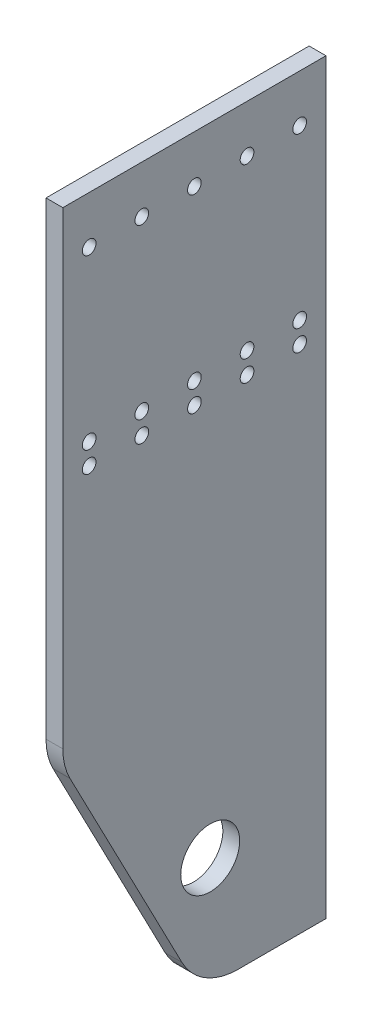
ISO-10303-21;
HEADER;
FILE_DESCRIPTION(('STEP AP214'),'2;1');
FILE_NAME('part.step','',(''),(''),'','','');
FILE_SCHEMA(('AUTOMOTIVE_DESIGN { 1 0 10303 214 1 1 1 1 }'));
ENDSEC;
DATA;
#1=APPLICATION_CONTEXT('core data for automotive mechanical design processes');
#2=APPLICATION_PROTOCOL_DEFINITION('international standard','automotive_design',2000,#1);
#3=PRODUCT_CONTEXT('',#1,'mechanical');
#4=PRODUCT('Part','Part','',(#3));
#5=PRODUCT_RELATED_PRODUCT_CATEGORY('part','',(#4));
#6=PRODUCT_DEFINITION_FORMATION('','',#4);
#7=PRODUCT_DEFINITION_CONTEXT('part definition',#1,'design');
#8=PRODUCT_DEFINITION('design','',#6,#7);
#9=PRODUCT_DEFINITION_SHAPE('','',#8);
#10=(LENGTH_UNIT() NAMED_UNIT(*) SI_UNIT(.MILLI.,.METRE.));
#11=(NAMED_UNIT(*) PLANE_ANGLE_UNIT() SI_UNIT($,.RADIAN.));
#12=(NAMED_UNIT(*) SI_UNIT($,.STERADIAN.) SOLID_ANGLE_UNIT());
#13=UNCERTAINTY_MEASURE_WITH_UNIT(LENGTH_MEASURE(1.E-05),#10,'distance_accuracy_value','');
#14=(GEOMETRIC_REPRESENTATION_CONTEXT(3) GLOBAL_UNCERTAINTY_ASSIGNED_CONTEXT((#13)) GLOBAL_UNIT_ASSIGNED_CONTEXT((#10,
#11,#12)) REPRESENTATION_CONTEXT('',''));
#15=CARTESIAN_POINT('',(0.,0.,0.));
#16=DIRECTION('',(0.,0.,1.));
#17=DIRECTION('',(1.,0.,0.));
#18=AXIS2_PLACEMENT_3D('',#15,#16,#17);
#19=CARTESIAN_POINT('',(16.,505.,-25.));
#20=DIRECTION('',(-1.,0.,0.));
#21=DIRECTION('',(0.,0.,1.));
#22=AXIS2_PLACEMENT_3D('',#19,#20,#21);
#23=CYLINDRICAL_SURFACE('',#22,6.50000000000002);
#24=CARTESIAN_POINT('',(16.,505.,-25.));
#25=DIRECTION('',(-1.,0.,0.));
#26=DIRECTION('',(0.,0.,1.));
#27=AXIS2_PLACEMENT_3D('',#24,#25,#26);
#28=CIRCLE('',#27,6.50000000000002);
#29=CARTESIAN_POINT('',(16.,505.,-18.5));
#30=VERTEX_POINT('',#29);
#31=EDGE_CURVE('E174',#30,#30,#28,.T.);
#32=ORIENTED_EDGE('',*,*,#31,.F.);
#33=EDGE_LOOP('',(#32));
#34=FACE_BOUND('',#33,.T.);
#35=CARTESIAN_POINT('',(0.,505.,-25.));
#36=DIRECTION('',(-1.,0.,0.));
#37=DIRECTION('',(0.,0.,1.));
#38=AXIS2_PLACEMENT_3D('',#35,#36,#37);
#39=CIRCLE('',#38,6.50000000000002);
#40=CARTESIAN_POINT('',(0.,505.,-18.5));
#41=VERTEX_POINT('',#40);
#42=EDGE_CURVE('E177',#41,#41,#39,.T.);
#43=ORIENTED_EDGE('',*,*,#42,.T.);
#44=EDGE_LOOP('',(#43));
#45=FACE_BOUND('',#44,.T.);
#46=ADVANCED_FACE('F37',(#34,#45),#23,.F.);
#47=CARTESIAN_POINT('',(16.,505.,-75.));
#48=DIRECTION('',(-1.,0.,0.));
#49=DIRECTION('',(0.,0.,1.));
#50=AXIS2_PLACEMENT_3D('',#47,#48,#49);
#51=CYLINDRICAL_SURFACE('',#50,6.50000000000002);
#52=CARTESIAN_POINT('',(16.,505.,-75.));
#53=DIRECTION('',(-1.,0.,0.));
#54=DIRECTION('',(0.,0.,1.));
#55=AXIS2_PLACEMENT_3D('',#52,#53,#54);
#56=CIRCLE('',#55,6.50000000000002);
#57=CARTESIAN_POINT('',(16.,505.,-68.4999999999999));
#58=VERTEX_POINT('',#57);
#59=EDGE_CURVE('E168',#58,#58,#56,.T.);
#60=ORIENTED_EDGE('',*,*,#59,.F.);
#61=EDGE_LOOP('',(#60));
#62=FACE_BOUND('',#61,.T.);
#63=CARTESIAN_POINT('',(0.,505.,-75.));
#64=DIRECTION('',(-1.,0.,0.));
#65=DIRECTION('',(0.,0.,1.));
#66=AXIS2_PLACEMENT_3D('',#63,#64,#65);
#67=CIRCLE('',#66,6.50000000000002);
#68=CARTESIAN_POINT('',(0.,505.,-68.4999999999999));
#69=VERTEX_POINT('',#68);
#70=EDGE_CURVE('E171',#69,#69,#67,.T.);
#71=ORIENTED_EDGE('',*,*,#70,.T.);
#72=EDGE_LOOP('',(#71));
#73=FACE_BOUND('',#72,.T.);
#74=ADVANCED_FACE('F273',(#62,#73),#51,.F.);
#75=CARTESIAN_POINT('',(16.,505.,-125.));
#76=DIRECTION('',(-1.,0.,0.));
#77=DIRECTION('',(0.,0.,1.));
#78=AXIS2_PLACEMENT_3D('',#75,#76,#77);
#79=CYLINDRICAL_SURFACE('',#78,6.50000000000002);
#80=CARTESIAN_POINT('',(16.,505.,-125.));
#81=DIRECTION('',(-1.,0.,0.));
#82=DIRECTION('',(0.,0.,1.));
#83=AXIS2_PLACEMENT_3D('',#80,#81,#82);
#84=CIRCLE('',#83,6.50000000000002);
#85=CARTESIAN_POINT('',(16.,505.,-118.5));
#86=VERTEX_POINT('',#85);
#87=EDGE_CURVE('E162',#86,#86,#84,.T.);
#88=ORIENTED_EDGE('',*,*,#87,.F.);
#89=EDGE_LOOP('',(#88));
#90=FACE_BOUND('',#89,.T.);
#91=CARTESIAN_POINT('',(0.,505.,-125.));
#92=DIRECTION('',(-1.,0.,0.));
#93=DIRECTION('',(0.,0.,1.));
#94=AXIS2_PLACEMENT_3D('',#91,#92,#93);
#95=CIRCLE('',#94,6.50000000000002);
#96=CARTESIAN_POINT('',(0.,505.,-118.5));
#97=VERTEX_POINT('',#96);
#98=EDGE_CURVE('E165',#97,#97,#95,.T.);
#99=ORIENTED_EDGE('',*,*,#98,.T.);
#100=EDGE_LOOP('',(#99));
#101=FACE_BOUND('',#100,.T.);
#102=ADVANCED_FACE('F279',(#90,#101),#79,.F.);
#103=CARTESIAN_POINT('',(16.,485.,-25.));
#104=DIRECTION('',(-1.,0.,0.));
#105=DIRECTION('',(0.,0.,1.));
#106=AXIS2_PLACEMENT_3D('',#103,#104,#105);
#107=CYLINDRICAL_SURFACE('',#106,6.50000000000002);
#108=CARTESIAN_POINT('',(16.,485.,-25.));
#109=DIRECTION('',(-1.,0.,0.));
#110=DIRECTION('',(0.,0.,1.));
#111=AXIS2_PLACEMENT_3D('',#108,#109,#110);
#112=CIRCLE('',#111,6.50000000000002);
#113=CARTESIAN_POINT('',(16.,485.,-18.5));
#114=VERTEX_POINT('',#113);
#115=EDGE_CURVE('E156',#114,#114,#112,.T.);
#116=ORIENTED_EDGE('',*,*,#115,.F.);
#117=EDGE_LOOP('',(#116));
#118=FACE_BOUND('',#117,.T.);
#119=CARTESIAN_POINT('',(0.,485.,-25.));
#120=DIRECTION('',(-1.,0.,0.));
#121=DIRECTION('',(0.,0.,1.));
#122=AXIS2_PLACEMENT_3D('',#119,#120,#121);
#123=CIRCLE('',#122,6.50000000000002);
#124=CARTESIAN_POINT('',(0.,485.,-18.5));
#125=VERTEX_POINT('',#124);
#126=EDGE_CURVE('E159',#125,#125,#123,.T.);
#127=ORIENTED_EDGE('',*,*,#126,.T.);
#128=EDGE_LOOP('',(#127));
#129=FACE_BOUND('',#128,.T.);
#130=ADVANCED_FACE('F287',(#118,#129),#107,.F.);
#131=CARTESIAN_POINT('',(16.,485.,-75.));
#132=DIRECTION('',(-1.,0.,0.));
#133=DIRECTION('',(0.,0.,1.));
#134=AXIS2_PLACEMENT_3D('',#131,#132,#133);
#135=CYLINDRICAL_SURFACE('',#134,6.50000000000002);
#136=CARTESIAN_POINT('',(16.,485.,-75.));
#137=DIRECTION('',(-1.,0.,0.));
#138=DIRECTION('',(0.,0.,1.));
#139=AXIS2_PLACEMENT_3D('',#136,#137,#138);
#140=CIRCLE('',#139,6.50000000000002);
#141=CARTESIAN_POINT('',(16.,485.,-68.4999999999999));
#142=VERTEX_POINT('',#141);
#143=EDGE_CURVE('E150',#142,#142,#140,.T.);
#144=ORIENTED_EDGE('',*,*,#143,.F.);
#145=EDGE_LOOP('',(#144));
#146=FACE_BOUND('',#145,.T.);
#147=CARTESIAN_POINT('',(0.,485.,-75.));
#148=DIRECTION('',(-1.,0.,0.));
#149=DIRECTION('',(0.,0.,1.));
#150=AXIS2_PLACEMENT_3D('',#147,#148,#149);
#151=CIRCLE('',#150,6.50000000000002);
#152=CARTESIAN_POINT('',(0.,485.,-68.4999999999999));
#153=VERTEX_POINT('',#152);
#154=EDGE_CURVE('E153',#153,#153,#151,.T.);
#155=ORIENTED_EDGE('',*,*,#154,.T.);
#156=EDGE_LOOP('',(#155));
#157=FACE_BOUND('',#156,.T.);
#158=ADVANCED_FACE('F291',(#146,#157),#135,.F.);
#159=CARTESIAN_POINT('',(16.,485.,-125.));
#160=DIRECTION('',(-1.,0.,0.));
#161=DIRECTION('',(0.,0.,1.));
#162=AXIS2_PLACEMENT_3D('',#159,#160,#161);
#163=CYLINDRICAL_SURFACE('',#162,6.50000000000002);
#164=CARTESIAN_POINT('',(16.,485.,-125.));
#165=DIRECTION('',(-1.,0.,0.));
#166=DIRECTION('',(0.,0.,1.));
#167=AXIS2_PLACEMENT_3D('',#164,#165,#166);
#168=CIRCLE('',#167,6.50000000000002);
#169=CARTESIAN_POINT('',(16.,485.,-118.5));
#170=VERTEX_POINT('',#169);
#171=EDGE_CURVE('E144',#170,#170,#168,.T.);
#172=ORIENTED_EDGE('',*,*,#171,.F.);
#173=EDGE_LOOP('',(#172));
#174=FACE_BOUND('',#173,.T.);
#175=CARTESIAN_POINT('',(0.,485.,-125.));
#176=DIRECTION('',(-1.,0.,0.));
#177=DIRECTION('',(0.,0.,1.));
#178=AXIS2_PLACEMENT_3D('',#175,#176,#177);
#179=CIRCLE('',#178,6.50000000000002);
#180=CARTESIAN_POINT('',(0.,485.,-118.5));
#181=VERTEX_POINT('',#180);
#182=EDGE_CURVE('E147',#181,#181,#179,.T.);
#183=ORIENTED_EDGE('',*,*,#182,.T.);
#184=EDGE_LOOP('',(#183));
#185=FACE_BOUND('',#184,.T.);
#186=ADVANCED_FACE('F295',(#174,#185),#163,.F.);
#187=CARTESIAN_POINT('',(16.,665.,-25.));
#188=DIRECTION('',(-1.,0.,0.));
#189=DIRECTION('',(0.,0.,1.));
#190=AXIS2_PLACEMENT_3D('',#187,#188,#189);
#191=CYLINDRICAL_SURFACE('',#190,6.50000000000002);
#192=CARTESIAN_POINT('',(16.,665.,-25.));
#193=DIRECTION('',(-1.,0.,0.));
#194=DIRECTION('',(0.,0.,1.));
#195=AXIS2_PLACEMENT_3D('',#192,#193,#194);
#196=CIRCLE('',#195,6.50000000000002);
#197=CARTESIAN_POINT('',(16.,665.,-18.5));
#198=VERTEX_POINT('',#197);
#199=EDGE_CURVE('E138',#198,#198,#196,.T.);
#200=ORIENTED_EDGE('',*,*,#199,.F.);
#201=EDGE_LOOP('',(#200));
#202=FACE_BOUND('',#201,.T.);
#203=CARTESIAN_POINT('',(0.,665.,-25.));
#204=DIRECTION('',(-1.,0.,0.));
#205=DIRECTION('',(0.,0.,1.));
#206=AXIS2_PLACEMENT_3D('',#203,#204,#205);
#207=CIRCLE('',#206,6.50000000000002);
#208=CARTESIAN_POINT('',(0.,665.,-18.5));
#209=VERTEX_POINT('',#208);
#210=EDGE_CURVE('E141',#209,#209,#207,.T.);
#211=ORIENTED_EDGE('',*,*,#210,.T.);
#212=EDGE_LOOP('',(#211));
#213=FACE_BOUND('',#212,.T.);
#214=ADVANCED_FACE('F299',(#202,#213),#191,.F.);
#215=CARTESIAN_POINT('',(16.,665.,-75.));
#216=DIRECTION('',(-1.,0.,0.));
#217=DIRECTION('',(0.,0.,1.));
#218=AXIS2_PLACEMENT_3D('',#215,#216,#217);
#219=CYLINDRICAL_SURFACE('',#218,6.50000000000002);
#220=CARTESIAN_POINT('',(16.,665.,-75.));
#221=DIRECTION('',(-1.,0.,0.));
#222=DIRECTION('',(0.,0.,1.));
#223=AXIS2_PLACEMENT_3D('',#220,#221,#222);
#224=CIRCLE('',#223,6.50000000000002);
#225=CARTESIAN_POINT('',(16.,665.,-68.4999999999999));
#226=VERTEX_POINT('',#225);
#227=EDGE_CURVE('E132',#226,#226,#224,.T.);
#228=ORIENTED_EDGE('',*,*,#227,.F.);
#229=EDGE_LOOP('',(#228));
#230=FACE_BOUND('',#229,.T.);
#231=CARTESIAN_POINT('',(0.,665.,-75.));
#232=DIRECTION('',(-1.,0.,0.));
#233=DIRECTION('',(0.,0.,1.));
#234=AXIS2_PLACEMENT_3D('',#231,#232,#233);
#235=CIRCLE('',#234,6.50000000000002);
#236=CARTESIAN_POINT('',(0.,665.,-68.4999999999999));
#237=VERTEX_POINT('',#236);
#238=EDGE_CURVE('E135',#237,#237,#235,.T.);
#239=ORIENTED_EDGE('',*,*,#238,.T.);
#240=EDGE_LOOP('',(#239));
#241=FACE_BOUND('',#240,.T.);
#242=ADVANCED_FACE('F303',(#230,#241),#219,.F.);
#243=CARTESIAN_POINT('',(16.,665.,-125.));
#244=DIRECTION('',(-1.,0.,0.));
#245=DIRECTION('',(0.,0.,1.));
#246=AXIS2_PLACEMENT_3D('',#243,#244,#245);
#247=CYLINDRICAL_SURFACE('',#246,6.50000000000002);
#248=CARTESIAN_POINT('',(16.,665.,-125.));
#249=DIRECTION('',(-1.,0.,0.));
#250=DIRECTION('',(0.,0.,1.));
#251=AXIS2_PLACEMENT_3D('',#248,#249,#250);
#252=CIRCLE('',#251,6.50000000000002);
#253=CARTESIAN_POINT('',(16.,665.,-118.5));
#254=VERTEX_POINT('',#253);
#255=EDGE_CURVE('E113',#254,#254,#252,.T.);
#256=ORIENTED_EDGE('',*,*,#255,.F.);
#257=EDGE_LOOP('',(#256));
#258=FACE_BOUND('',#257,.T.);
#259=CARTESIAN_POINT('',(0.,665.,-125.));
#260=DIRECTION('',(-1.,0.,0.));
#261=DIRECTION('',(0.,0.,1.));
#262=AXIS2_PLACEMENT_3D('',#259,#260,#261);
#263=CIRCLE('',#262,6.50000000000002);
#264=CARTESIAN_POINT('',(0.,665.,-118.5));
#265=VERTEX_POINT('',#264);
#266=EDGE_CURVE('E129',#265,#265,#263,.T.);
#267=ORIENTED_EDGE('',*,*,#266,.T.);
#268=EDGE_LOOP('',(#267));
#269=FACE_BOUND('',#268,.T.);
#270=ADVANCED_FACE('F307',(#258,#269),#247,.F.);
#271=CARTESIAN_POINT('',(16.,0.,0.));
#272=DIRECTION('',(0.,1.,0.));
#273=DIRECTION('',(0.,0.,1.));
#274=AXIS2_PLACEMENT_3D('',#271,#272,#273);
#275=PLANE('',#274);
#276=DIRECTION('',(0.,0.,-1.));
#277=VECTOR('',#276,1.);
#278=CARTESIAN_POINT('',(16.,0.,0.));
#279=LINE('',#278,#277);
#280=CARTESIAN_POINT('',(16.,0.,-166.427213457306));
#281=VERTEX_POINT('',#280);
#282=CARTESIAN_POINT('',(16.,0.,-250.));
#283=VERTEX_POINT('',#282);
#284=EDGE_CURVE('E115',#281,#283,#279,.T.);
#285=ORIENTED_EDGE('',*,*,#284,.F.);
#286=DIRECTION('',(-1.,0.,0.));
#287=VECTOR('',#286,1.);
#288=CARTESIAN_POINT('',(16.,0.,-166.427213457306));
#289=LINE('',#288,#287);
#290=CARTESIAN_POINT('',(0.,0.,-166.427213457306));
#291=VERTEX_POINT('',#290);
#292=EDGE_CURVE('E180',#281,#291,#289,.T.);
#293=ORIENTED_EDGE('',*,*,#292,.T.);
#294=DIRECTION('',(0.,0.,-1.));
#295=VECTOR('',#294,1.);
#296=CARTESIAN_POINT('',(0.,0.,0.));
#297=LINE('',#296,#295);
#298=CARTESIAN_POINT('',(0.,0.,-250.));
#299=VERTEX_POINT('',#298);
#300=EDGE_CURVE('E119',#291,#299,#297,.T.);
#301=ORIENTED_EDGE('',*,*,#300,.T.);
#302=DIRECTION('',(-1.,0.,0.));
#303=VECTOR('',#302,1.);
#304=CARTESIAN_POINT('',(16.,0.,-250.));
#305=LINE('',#304,#303);
#306=EDGE_CURVE('E110',#283,#299,#305,.T.);
#307=ORIENTED_EDGE('',*,*,#306,.F.);
#308=EDGE_LOOP('',(#285,#293,#301,#307));
#309=FACE_BOUND('',#308,.T.);
#310=ADVANCED_FACE('F204',(#309),#275,.F.);
#311=CARTESIAN_POINT('',(16.,0.,-250.));
#312=DIRECTION('',(0.,0.,1.));
#313=DIRECTION('',(1.,0.,0.));
#314=AXIS2_PLACEMENT_3D('',#311,#312,#313);
#315=PLANE('',#314);
#316=DIRECTION('',(0.,1.,0.));
#317=VECTOR('',#316,1.);
#318=CARTESIAN_POINT('',(0.,0.,-250.));
#319=LINE('',#318,#317);
#320=CARTESIAN_POINT('',(0.,710.,-250.));
#321=VERTEX_POINT('',#320);
#322=EDGE_CURVE('E121',#299,#321,#319,.T.);
#323=ORIENTED_EDGE('',*,*,#322,.T.);
#324=DIRECTION('',(1.,0.,0.));
#325=VECTOR('',#324,1.);
#326=CARTESIAN_POINT('',(-50.,710.,-250.));
#327=LINE('',#326,#325);
#328=CARTESIAN_POINT('',(16.,710.,-250.));
#329=VERTEX_POINT('',#328);
#330=EDGE_CURVE('E52',#321,#329,#327,.T.);
#331=ORIENTED_EDGE('',*,*,#330,.T.);
#332=DIRECTION('',(0.,1.,0.));
#333=VECTOR('',#332,1.);
#334=CARTESIAN_POINT('',(16.,0.,-250.));
#335=LINE('',#334,#333);
#336=EDGE_CURVE('E107',#283,#329,#335,.T.);
#337=ORIENTED_EDGE('',*,*,#336,.F.);
#338=ORIENTED_EDGE('',*,*,#306,.T.);
#339=EDGE_LOOP('',(#323,#331,#337,#338));
#340=FACE_BOUND('',#339,.T.);
#341=ADVANCED_FACE('F263',(#340),#315,.F.);
#342=CARTESIAN_POINT('',(16.,0.,0.));
#343=DIRECTION('',(0.,0.,1.));
#344=DIRECTION('',(1.,0.,0.));
#345=AXIS2_PLACEMENT_3D('',#342,#343,#344);
#346=PLANE('',#345);
#347=DIRECTION('',(1.,0.,0.));
#348=VECTOR('',#347,1.);
#349=CARTESIAN_POINT('',(-50.,710.,0.));
#350=LINE('',#349,#348);
#351=CARTESIAN_POINT('',(0.,710.,0.));
#352=VERTEX_POINT('',#351);
#353=CARTESIAN_POINT('',(16.,710.,0.));
#354=VERTEX_POINT('',#353);
#355=EDGE_CURVE('E94',#352,#354,#350,.T.);
#356=ORIENTED_EDGE('',*,*,#355,.F.);
#357=DIRECTION('',(0.,1.,0.));
#358=VECTOR('',#357,1.);
#359=CARTESIAN_POINT('',(0.,0.,0.));
#360=LINE('',#359,#358);
#361=CARTESIAN_POINT('',(0.,264.667718187126,0.));
#362=VERTEX_POINT('',#361);
#363=EDGE_CURVE('E125',#362,#352,#360,.T.);
#364=ORIENTED_EDGE('',*,*,#363,.F.);
#365=DIRECTION('',(-1.,0.,0.));
#366=VECTOR('',#365,1.);
#367=CARTESIAN_POINT('',(16.,264.667718187126,0.));
#368=LINE('',#367,#366);
#369=CARTESIAN_POINT('',(16.,264.667718187126,0.));
#370=VERTEX_POINT('',#369);
#371=EDGE_CURVE('E45',#362,#370,#368,.F.);
#372=ORIENTED_EDGE('',*,*,#371,.T.);
#373=DIRECTION('',(0.,1.,0.));
#374=VECTOR('',#373,1.);
#375=CARTESIAN_POINT('',(16.,0.,0.));
#376=LINE('',#375,#374);
#377=EDGE_CURVE('E104',#370,#354,#376,.T.);
#378=ORIENTED_EDGE('',*,*,#377,.T.);
#379=EDGE_LOOP('',(#356,#364,#372,#378));
#380=FACE_BOUND('',#379,.T.);
#381=ADVANCED_FACE('F109',(#380),#346,.T.);
#382=CARTESIAN_POINT('',(16.,0.,0.));
#383=DIRECTION('',(1.,0.,0.));
#384=DIRECTION('',(0.,0.,-1.));
#385=AXIS2_PLACEMENT_3D('',#382,#383,#384);
#386=PLANE('',#385);
#387=DIRECTION('',(0.,0.,-1.));
#388=VECTOR('',#387,1.);
#389=CARTESIAN_POINT('',(16.,710.,0.));
#390=LINE('',#389,#388);
#391=EDGE_CURVE('E97',#354,#329,#390,.T.);
#392=ORIENTED_EDGE('',*,*,#391,.F.);
#393=ORIENTED_EDGE('',*,*,#377,.F.);
#394=CARTESIAN_POINT('',(16.,264.667718187126,-60.));
#395=DIRECTION('',(1.,0.,0.));
#396=DIRECTION('',(0.,0.,-1.));
#397=AXIS2_PLACEMENT_3D('',#394,#395,#396);
#398=CIRCLE('',#397,60.);
#399=CARTESIAN_POINT('',(16.,236.986553988607,-6.76699192592428));
#400=VERTEX_POINT('',#399);
#401=EDGE_CURVE('E192',#370,#400,#398,.T.);
#402=ORIENTED_EDGE('',*,*,#401,.T.);
#403=DIRECTION('',(0.,0.887216801234595,0.46135273664199));
#404=VECTOR('',#403,1.);
#405=CARTESIAN_POINT('',(16.,53.2115869017632,-102.329974811083));
#406=LINE('',#405,#404);
#407=CARTESIAN_POINT('',(16.,32.3188358014806,-113.19420538323));
#408=VERTEX_POINT('',#407);
#409=EDGE_CURVE('E122',#408,#400,#406,.T.);
#410=ORIENTED_EDGE('',*,*,#409,.F.);
#411=CARTESIAN_POINT('',(16.,60.,-166.427213457306));
#412=DIRECTION('',(1.,0.,0.));
#413=DIRECTION('',(0.,0.,-1.));
#414=AXIS2_PLACEMENT_3D('',#411,#412,#413);
#415=CIRCLE('',#414,60.);
#416=EDGE_CURVE('E194',#408,#281,#415,.T.);
#417=ORIENTED_EDGE('',*,*,#416,.T.);
#418=ORIENTED_EDGE('',*,*,#284,.T.);
#419=ORIENTED_EDGE('',*,*,#336,.T.);
#420=EDGE_LOOP('',(#392,#393,#402,#410,#417,#418,#419));
#421=FACE_BOUND('',#420,.T.);
#422=CARTESIAN_POINT('',(16.,105.,-140.));
#423=DIRECTION('',(-1.,0.,0.));
#424=DIRECTION('',(0.,0.,1.));
#425=AXIS2_PLACEMENT_3D('',#422,#423,#424);
#426=CIRCLE('',#425,28.);
#427=CARTESIAN_POINT('',(16.,105.,-112.));
#428=VERTEX_POINT('',#427);
#429=EDGE_CURVE('E256',#428,#428,#426,.T.);
#430=ORIENTED_EDGE('',*,*,#429,.T.);
#431=EDGE_LOOP('',(#430));
#432=FACE_BOUND('',#431,.T.);
#433=CARTESIAN_POINT('',(16.,505.,-175.));
#434=DIRECTION('',(-1.,0.,0.));
#435=DIRECTION('',(0.,0.,1.));
#436=AXIS2_PLACEMENT_3D('',#433,#434,#435);
#437=CIRCLE('',#436,6.50000000000002);
#438=CARTESIAN_POINT('',(16.,505.,-168.5));
#439=VERTEX_POINT('',#438);
#440=EDGE_CURVE('E253',#439,#439,#437,.T.);
#441=ORIENTED_EDGE('',*,*,#440,.T.);
#442=EDGE_LOOP('',(#441));
#443=FACE_BOUND('',#442,.T.);
#444=CARTESIAN_POINT('',(16.,485.,-175.));
#445=DIRECTION('',(-1.,0.,0.));
#446=DIRECTION('',(0.,0.,1.));
#447=AXIS2_PLACEMENT_3D('',#444,#445,#446);
#448=CIRCLE('',#447,6.50000000000002);
#449=CARTESIAN_POINT('',(16.,485.,-168.5));
#450=VERTEX_POINT('',#449);
#451=EDGE_CURVE('E247',#450,#450,#448,.T.);
#452=ORIENTED_EDGE('',*,*,#451,.T.);
#453=EDGE_LOOP('',(#452));
#454=FACE_BOUND('',#453,.T.);
#455=CARTESIAN_POINT('',(16.,665.,-175.));
#456=DIRECTION('',(-1.,0.,0.));
#457=DIRECTION('',(0.,0.,1.));
#458=AXIS2_PLACEMENT_3D('',#455,#456,#457);
#459=CIRCLE('',#458,6.50000000000002);
#460=CARTESIAN_POINT('',(16.,665.,-168.5));
#461=VERTEX_POINT('',#460);
#462=EDGE_CURVE('E241',#461,#461,#459,.T.);
#463=ORIENTED_EDGE('',*,*,#462,.T.);
#464=EDGE_LOOP('',(#463));
#465=FACE_BOUND('',#464,.T.);
#466=CARTESIAN_POINT('',(16.,665.,-225.));
#467=DIRECTION('',(-1.,0.,0.));
#468=DIRECTION('',(0.,0.,1.));
#469=AXIS2_PLACEMENT_3D('',#466,#467,#468);
#470=CIRCLE('',#469,6.50000000000002);
#471=CARTESIAN_POINT('',(16.,665.,-218.5));
#472=VERTEX_POINT('',#471);
#473=EDGE_CURVE('E217',#472,#472,#470,.T.);
#474=ORIENTED_EDGE('',*,*,#473,.T.);
#475=EDGE_LOOP('',(#474));
#476=FACE_BOUND('',#475,.T.);
#477=CARTESIAN_POINT('',(16.,505.,-225.));
#478=DIRECTION('',(-1.,0.,0.));
#479=DIRECTION('',(0.,0.,1.));
#480=AXIS2_PLACEMENT_3D('',#477,#478,#479);
#481=CIRCLE('',#480,6.50000000000002);
#482=CARTESIAN_POINT('',(16.,505.,-218.5));
#483=VERTEX_POINT('',#482);
#484=EDGE_CURVE('E234',#483,#483,#481,.T.);
#485=ORIENTED_EDGE('',*,*,#484,.T.);
#486=EDGE_LOOP('',(#485));
#487=FACE_BOUND('',#486,.T.);
#488=CARTESIAN_POINT('',(16.,485.,-225.));
#489=DIRECTION('',(-1.,0.,0.));
#490=DIRECTION('',(0.,0.,1.));
#491=AXIS2_PLACEMENT_3D('',#488,#489,#490);
#492=CIRCLE('',#491,6.50000000000002);
#493=CARTESIAN_POINT('',(16.,485.,-218.5));
#494=VERTEX_POINT('',#493);
#495=EDGE_CURVE('E227',#494,#494,#492,.T.);
#496=ORIENTED_EDGE('',*,*,#495,.T.);
#497=EDGE_LOOP('',(#496));
#498=FACE_BOUND('',#497,.T.);
#499=ORIENTED_EDGE('',*,*,#255,.T.);
#500=EDGE_LOOP('',(#499));
#501=FACE_BOUND('',#500,.T.);
#502=ORIENTED_EDGE('',*,*,#227,.T.);
#503=EDGE_LOOP('',(#502));
#504=FACE_BOUND('',#503,.T.);
#505=ORIENTED_EDGE('',*,*,#199,.T.);
#506=EDGE_LOOP('',(#505));
#507=FACE_BOUND('',#506,.T.);
#508=ORIENTED_EDGE('',*,*,#171,.T.);
#509=EDGE_LOOP('',(#508));
#510=FACE_BOUND('',#509,.T.);
#511=ORIENTED_EDGE('',*,*,#143,.T.);
#512=EDGE_LOOP('',(#511));
#513=FACE_BOUND('',#512,.T.);
#514=ORIENTED_EDGE('',*,*,#115,.T.);
#515=EDGE_LOOP('',(#514));
#516=FACE_BOUND('',#515,.T.);
#517=ORIENTED_EDGE('',*,*,#87,.T.);
#518=EDGE_LOOP('',(#517));
#519=FACE_BOUND('',#518,.T.);
#520=ORIENTED_EDGE('',*,*,#59,.T.);
#521=EDGE_LOOP('',(#520));
#522=FACE_BOUND('',#521,.T.);
#523=ORIENTED_EDGE('',*,*,#31,.T.);
#524=EDGE_LOOP('',(#523));
#525=FACE_BOUND('',#524,.T.);
#526=ADVANCED_FACE('F102',(#421,#432,#443,#454,#465,#476,#487,#498,#501,#504,#507,#510,#513,
#516,#519,#522,#525),#386,.T.);
#527=CARTESIAN_POINT('',(0.,0.,0.));
#528=DIRECTION('',(1.,0.,0.));
#529=DIRECTION('',(0.,0.,-1.));
#530=AXIS2_PLACEMENT_3D('',#527,#528,#529);
#531=PLANE('',#530);
#532=CARTESIAN_POINT('',(0.,105.,-140.));
#533=DIRECTION('',(-1.,0.,0.));
#534=DIRECTION('',(0.,0.,1.));
#535=AXIS2_PLACEMENT_3D('',#532,#533,#534);
#536=CIRCLE('',#535,28.);
#537=CARTESIAN_POINT('',(0.,105.,-112.));
#538=VERTEX_POINT('',#537);
#539=EDGE_CURVE('E257',#538,#538,#536,.T.);
#540=ORIENTED_EDGE('',*,*,#539,.F.);
#541=EDGE_LOOP('',(#540));
#542=FACE_BOUND('',#541,.T.);
#543=CARTESIAN_POINT('',(0.,505.,-175.));
#544=DIRECTION('',(-1.,0.,0.));
#545=DIRECTION('',(0.,0.,1.));
#546=AXIS2_PLACEMENT_3D('',#543,#544,#545);
#547=CIRCLE('',#546,6.50000000000002);
#548=CARTESIAN_POINT('',(0.,505.,-168.5));
#549=VERTEX_POINT('',#548);
#550=EDGE_CURVE('E250',#549,#549,#547,.T.);
#551=ORIENTED_EDGE('',*,*,#550,.F.);
#552=EDGE_LOOP('',(#551));
#553=FACE_BOUND('',#552,.T.);
#554=CARTESIAN_POINT('',(0.,485.,-175.));
#555=DIRECTION('',(-1.,0.,0.));
#556=DIRECTION('',(0.,0.,1.));
#557=AXIS2_PLACEMENT_3D('',#554,#555,#556);
#558=CIRCLE('',#557,6.50000000000002);
#559=CARTESIAN_POINT('',(0.,485.,-168.5));
#560=VERTEX_POINT('',#559);
#561=EDGE_CURVE('E244',#560,#560,#558,.T.);
#562=ORIENTED_EDGE('',*,*,#561,.F.);
#563=EDGE_LOOP('',(#562));
#564=FACE_BOUND('',#563,.T.);
#565=CARTESIAN_POINT('',(0.,665.,-175.));
#566=DIRECTION('',(-1.,0.,0.));
#567=DIRECTION('',(0.,0.,1.));
#568=AXIS2_PLACEMENT_3D('',#565,#566,#567);
#569=CIRCLE('',#568,6.50000000000002);
#570=CARTESIAN_POINT('',(0.,665.,-168.5));
#571=VERTEX_POINT('',#570);
#572=EDGE_CURVE('E228',#571,#571,#569,.T.);
#573=ORIENTED_EDGE('',*,*,#572,.F.);
#574=EDGE_LOOP('',(#573));
#575=FACE_BOUND('',#574,.T.);
#576=CARTESIAN_POINT('',(0.,665.,-225.));
#577=DIRECTION('',(-1.,0.,0.));
#578=DIRECTION('',(0.,0.,1.));
#579=AXIS2_PLACEMENT_3D('',#576,#577,#578);
#580=CIRCLE('',#579,6.50000000000002);
#581=CARTESIAN_POINT('',(0.,665.,-218.5));
#582=VERTEX_POINT('',#581);
#583=EDGE_CURVE('E221',#582,#582,#580,.T.);
#584=ORIENTED_EDGE('',*,*,#583,.F.);
#585=EDGE_LOOP('',(#584));
#586=FACE_BOUND('',#585,.T.);
#587=CARTESIAN_POINT('',(0.,505.,-225.));
#588=DIRECTION('',(-1.,0.,0.));
#589=DIRECTION('',(0.,0.,1.));
#590=AXIS2_PLACEMENT_3D('',#587,#588,#589);
#591=CIRCLE('',#590,6.50000000000002);
#592=CARTESIAN_POINT('',(0.,505.,-218.5));
#593=VERTEX_POINT('',#592);
#594=EDGE_CURVE('E231',#593,#593,#591,.T.);
#595=ORIENTED_EDGE('',*,*,#594,.F.);
#596=EDGE_LOOP('',(#595));
#597=FACE_BOUND('',#596,.T.);
#598=CARTESIAN_POINT('',(0.,485.,-225.));
#599=DIRECTION('',(-1.,0.,0.));
#600=DIRECTION('',(0.,0.,1.));
#601=AXIS2_PLACEMENT_3D('',#598,#599,#600);
#602=CIRCLE('',#601,6.50000000000002);
#603=CARTESIAN_POINT('',(0.,485.,-218.5));
#604=VERTEX_POINT('',#603);
#605=EDGE_CURVE('E224',#604,#604,#602,.T.);
#606=ORIENTED_EDGE('',*,*,#605,.F.);
#607=EDGE_LOOP('',(#606));
#608=FACE_BOUND('',#607,.T.);
#609=ORIENTED_EDGE('',*,*,#363,.T.);
#610=DIRECTION('',(0.,0.,-1.));
#611=VECTOR('',#610,1.);
#612=CARTESIAN_POINT('',(0.,710.,0.));
#613=LINE('',#612,#611);
#614=EDGE_CURVE('E11',#352,#321,#613,.T.);
#615=ORIENTED_EDGE('',*,*,#614,.T.);
#616=ORIENTED_EDGE('',*,*,#322,.F.);
#617=ORIENTED_EDGE('',*,*,#300,.F.);
#618=CARTESIAN_POINT('',(0.,60.,-166.427213457306));
#619=DIRECTION('',(1.,0.,0.));
#620=DIRECTION('',(0.,0.,-1.));
#621=AXIS2_PLACEMENT_3D('',#618,#619,#620);
#622=CIRCLE('',#621,60.);
#623=CARTESIAN_POINT('',(0.,32.3188358014806,-113.19420538323));
#624=VERTEX_POINT('',#623);
#625=EDGE_CURVE('E185',#291,#624,#622,.F.);
#626=ORIENTED_EDGE('',*,*,#625,.T.);
#627=DIRECTION('',(0.,-0.887216801234595,-0.46135273664199));
#628=VECTOR('',#627,1.);
#629=CARTESIAN_POINT('',(0.,0.,-130.));
#630=LINE('',#629,#628);
#631=CARTESIAN_POINT('',(0.,236.986553988607,-6.7669919259243));
#632=VERTEX_POINT('',#631);
#633=EDGE_CURVE('E212',#632,#624,#630,.T.);
#634=ORIENTED_EDGE('',*,*,#633,.F.);
#635=CARTESIAN_POINT('',(0.,264.667718187126,-60.));
#636=DIRECTION('',(1.,0.,0.));
#637=DIRECTION('',(0.,0.,-1.));
#638=AXIS2_PLACEMENT_3D('',#635,#636,#637);
#639=CIRCLE('',#638,60.);
#640=EDGE_CURVE('E183',#632,#362,#639,.F.);
#641=ORIENTED_EDGE('',*,*,#640,.T.);
#642=EDGE_LOOP('',(#609,#615,#616,#617,#626,#634,#641));
#643=FACE_BOUND('',#642,.T.);
#644=ORIENTED_EDGE('',*,*,#266,.F.);
#645=EDGE_LOOP('',(#644));
#646=FACE_BOUND('',#645,.T.);
#647=ORIENTED_EDGE('',*,*,#238,.F.);
#648=EDGE_LOOP('',(#647));
#649=FACE_BOUND('',#648,.T.);
#650=ORIENTED_EDGE('',*,*,#210,.F.);
#651=EDGE_LOOP('',(#650));
#652=FACE_BOUND('',#651,.T.);
#653=ORIENTED_EDGE('',*,*,#182,.F.);
#654=EDGE_LOOP('',(#653));
#655=FACE_BOUND('',#654,.T.);
#656=ORIENTED_EDGE('',*,*,#154,.F.);
#657=EDGE_LOOP('',(#656));
#658=FACE_BOUND('',#657,.T.);
#659=ORIENTED_EDGE('',*,*,#126,.F.);
#660=EDGE_LOOP('',(#659));
#661=FACE_BOUND('',#660,.T.);
#662=ORIENTED_EDGE('',*,*,#98,.F.);
#663=EDGE_LOOP('',(#662));
#664=FACE_BOUND('',#663,.T.);
#665=ORIENTED_EDGE('',*,*,#70,.F.);
#666=EDGE_LOOP('',(#665));
#667=FACE_BOUND('',#666,.T.);
#668=ORIENTED_EDGE('',*,*,#42,.F.);
#669=EDGE_LOOP('',(#668));
#670=FACE_BOUND('',#669,.T.);
#671=ADVANCED_FACE('F210',(#542,#553,#564,#575,#586,#597,#608,#643,#646,#649,#652,#655,#658,
#661,#664,#667,#670),#531,.F.);
#672=CARTESIAN_POINT('',(20.,0.,-130.));
#673=DIRECTION('',(0.,0.46135273664199,-0.887216801234595));
#674=DIRECTION('',(0.,0.887216801234595,0.46135273664199));
#675=AXIS2_PLACEMENT_3D('',#672,#673,#674);
#676=PLANE('',#675);
#677=ORIENTED_EDGE('',*,*,#633,.T.);
#678=DIRECTION('',(-1.,0.,0.));
#679=VECTOR('',#678,1.);
#680=CARTESIAN_POINT('',(20.,32.3188358014806,-113.19420538323));
#681=LINE('',#680,#679);
#682=EDGE_CURVE('E190',#624,#408,#681,.F.);
#683=ORIENTED_EDGE('',*,*,#682,.T.);
#684=ORIENTED_EDGE('',*,*,#409,.T.);
#685=DIRECTION('',(-1.,0.,0.));
#686=VECTOR('',#685,1.);
#687=CARTESIAN_POINT('',(0.,236.986553988607,-6.7669919259243));
#688=LINE('',#687,#686);
#689=EDGE_CURVE('E187',#400,#632,#688,.T.);
#690=ORIENTED_EDGE('',*,*,#689,.T.);
#691=EDGE_LOOP('',(#677,#683,#684,#690));
#692=FACE_BOUND('',#691,.T.);
#693=ADVANCED_FACE('F215',(#692),#676,.F.);
#694=CARTESIAN_POINT('',(16.,485.,-225.));
#695=DIRECTION('',(-1.,0.,0.));
#696=DIRECTION('',(0.,0.,1.));
#697=AXIS2_PLACEMENT_3D('',#694,#695,#696);
#698=CYLINDRICAL_SURFACE('',#697,6.50000000000002);
#699=ORIENTED_EDGE('',*,*,#495,.F.);
#700=EDGE_LOOP('',(#699));
#701=FACE_BOUND('',#700,.T.);
#702=ORIENTED_EDGE('',*,*,#605,.T.);
#703=EDGE_LOOP('',(#702));
#704=FACE_BOUND('',#703,.T.);
#705=ADVANCED_FACE('F325',(#701,#704),#698,.F.);
#706=CARTESIAN_POINT('',(16.,505.,-225.));
#707=DIRECTION('',(-1.,0.,0.));
#708=DIRECTION('',(0.,0.,1.));
#709=AXIS2_PLACEMENT_3D('',#706,#707,#708);
#710=CYLINDRICAL_SURFACE('',#709,6.50000000000002);
#711=ORIENTED_EDGE('',*,*,#484,.F.);
#712=EDGE_LOOP('',(#711));
#713=FACE_BOUND('',#712,.T.);
#714=ORIENTED_EDGE('',*,*,#594,.T.);
#715=EDGE_LOOP('',(#714));
#716=FACE_BOUND('',#715,.T.);
#717=ADVANCED_FACE('F328',(#713,#716),#710,.F.);
#718=CARTESIAN_POINT('',(16.,665.,-225.));
#719=DIRECTION('',(-1.,0.,0.));
#720=DIRECTION('',(0.,0.,1.));
#721=AXIS2_PLACEMENT_3D('',#718,#719,#720);
#722=CYLINDRICAL_SURFACE('',#721,6.50000000000002);
#723=ORIENTED_EDGE('',*,*,#473,.F.);
#724=EDGE_LOOP('',(#723));
#725=FACE_BOUND('',#724,.T.);
#726=ORIENTED_EDGE('',*,*,#583,.T.);
#727=EDGE_LOOP('',(#726));
#728=FACE_BOUND('',#727,.T.);
#729=ADVANCED_FACE('F332',(#725,#728),#722,.F.);
#730=CARTESIAN_POINT('',(16.,665.,-175.));
#731=DIRECTION('',(-1.,0.,0.));
#732=DIRECTION('',(0.,0.,1.));
#733=AXIS2_PLACEMENT_3D('',#730,#731,#732);
#734=CYLINDRICAL_SURFACE('',#733,6.50000000000002);
#735=ORIENTED_EDGE('',*,*,#462,.F.);
#736=EDGE_LOOP('',(#735));
#737=FACE_BOUND('',#736,.T.);
#738=ORIENTED_EDGE('',*,*,#572,.T.);
#739=EDGE_LOOP('',(#738));
#740=FACE_BOUND('',#739,.T.);
#741=ADVANCED_FACE('F336',(#737,#740),#734,.F.);
#742=CARTESIAN_POINT('',(16.,485.,-175.));
#743=DIRECTION('',(-1.,0.,0.));
#744=DIRECTION('',(0.,0.,1.));
#745=AXIS2_PLACEMENT_3D('',#742,#743,#744);
#746=CYLINDRICAL_SURFACE('',#745,6.50000000000002);
#747=ORIENTED_EDGE('',*,*,#451,.F.);
#748=EDGE_LOOP('',(#747));
#749=FACE_BOUND('',#748,.T.);
#750=ORIENTED_EDGE('',*,*,#561,.T.);
#751=EDGE_LOOP('',(#750));
#752=FACE_BOUND('',#751,.T.);
#753=ADVANCED_FACE('F340',(#749,#752),#746,.F.);
#754=CARTESIAN_POINT('',(16.,505.,-175.));
#755=DIRECTION('',(-1.,0.,0.));
#756=DIRECTION('',(0.,0.,1.));
#757=AXIS2_PLACEMENT_3D('',#754,#755,#756);
#758=CYLINDRICAL_SURFACE('',#757,6.50000000000002);
#759=ORIENTED_EDGE('',*,*,#440,.F.);
#760=EDGE_LOOP('',(#759));
#761=FACE_BOUND('',#760,.T.);
#762=ORIENTED_EDGE('',*,*,#550,.T.);
#763=EDGE_LOOP('',(#762));
#764=FACE_BOUND('',#763,.T.);
#765=ADVANCED_FACE('F344',(#761,#764),#758,.F.);
#766=CARTESIAN_POINT('',(16.,105.,-140.));
#767=DIRECTION('',(-1.,0.,0.));
#768=DIRECTION('',(0.,0.,1.));
#769=AXIS2_PLACEMENT_3D('',#766,#767,#768);
#770=CYLINDRICAL_SURFACE('',#769,28.);
#771=ORIENTED_EDGE('',*,*,#429,.F.);
#772=EDGE_LOOP('',(#771));
#773=FACE_BOUND('',#772,.T.);
#774=ORIENTED_EDGE('',*,*,#539,.T.);
#775=EDGE_LOOP('',(#774));
#776=FACE_BOUND('',#775,.T.);
#777=ADVANCED_FACE('F271',(#773,#776),#770,.F.);
#778=CARTESIAN_POINT('',(16.,60.,-166.427213457306));
#779=DIRECTION('',(-1.,0.,0.));
#780=DIRECTION('',(0.,0.,1.));
#781=AXIS2_PLACEMENT_3D('',#778,#779,#780);
#782=CYLINDRICAL_SURFACE('',#781,60.);
#783=ORIENTED_EDGE('',*,*,#416,.F.);
#784=ORIENTED_EDGE('',*,*,#682,.F.);
#785=ORIENTED_EDGE('',*,*,#625,.F.);
#786=ORIENTED_EDGE('',*,*,#292,.F.);
#787=EDGE_LOOP('',(#783,#784,#785,#786));
#788=FACE_BOUND('',#787,.T.);
#789=ADVANCED_FACE('F206',(#788),#782,.T.);
#790=CARTESIAN_POINT('',(20.,264.667718187126,-60.));
#791=DIRECTION('',(1.,0.,0.));
#792=DIRECTION('',(0.,0.,-1.));
#793=AXIS2_PLACEMENT_3D('',#790,#791,#792);
#794=CYLINDRICAL_SURFACE('',#793,60.);
#795=ORIENTED_EDGE('',*,*,#401,.F.);
#796=ORIENTED_EDGE('',*,*,#371,.F.);
#797=ORIENTED_EDGE('',*,*,#640,.F.);
#798=ORIENTED_EDGE('',*,*,#689,.F.);
#799=EDGE_LOOP('',(#795,#796,#797,#798));
#800=FACE_BOUND('',#799,.T.);
#801=ADVANCED_FACE('F39',(#800),#794,.T.);
#802=CARTESIAN_POINT('',(-50.,710.,0.));
#803=DIRECTION('',(0.,-1.,0.));
#804=DIRECTION('',(0.,0.,-1.));
#805=AXIS2_PLACEMENT_3D('',#802,#803,#804);
#806=PLANE('',#805);
#807=ORIENTED_EDGE('',*,*,#355,.T.);
#808=ORIENTED_EDGE('',*,*,#391,.T.);
#809=ORIENTED_EDGE('',*,*,#330,.F.);
#810=ORIENTED_EDGE('',*,*,#614,.F.);
#811=EDGE_LOOP('',(#807,#808,#809,#810));
#812=FACE_BOUND('',#811,.T.);
#813=ADVANCED_FACE('F96',(#812),#806,.F.);
#814=CLOSED_SHELL('',(#46,#74,#102,#130,#158,#186,#214,#242,#270,#310,#341,#381,#526,#671,#693,
#705,#717,#729,#741,#753,#765,#777,#789,#801,#813));
#815=MANIFOLD_SOLID_BREP('B2',#814);
#816=ADVANCED_BREP_SHAPE_REPRESENTATION('',(#18,#815),#14);
#817=SHAPE_DEFINITION_REPRESENTATION(#9,#816);
ENDSEC;
END-ISO-10303-21;
